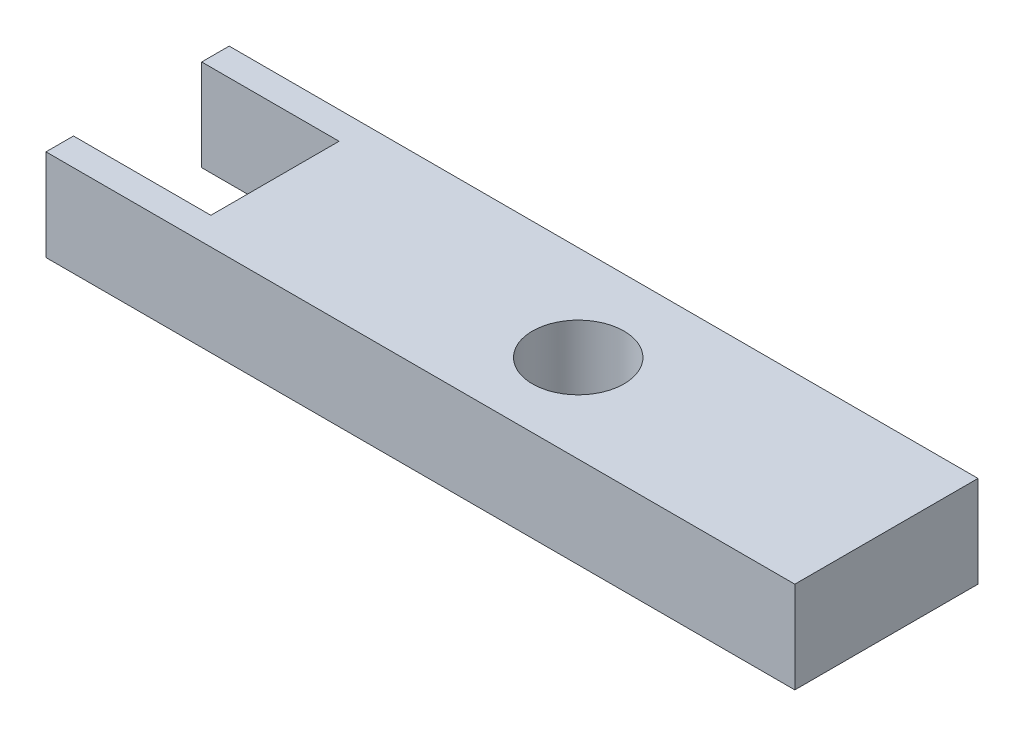
ISO-10303-21;
HEADER;
FILE_DESCRIPTION(('STEP AP214'),'2;1');
FILE_NAME('part.step','',(''),(''),'','','');
FILE_SCHEMA(('AUTOMOTIVE_DESIGN { 1 0 10303 214 1 1 1 1 }'));
ENDSEC;
DATA;
#1=APPLICATION_CONTEXT('core data for automotive mechanical design processes');
#2=APPLICATION_PROTOCOL_DEFINITION('international standard','automotive_design',2000,#1);
#3=PRODUCT_CONTEXT('',#1,'mechanical');
#4=PRODUCT('Part','Part','',(#3));
#5=PRODUCT_RELATED_PRODUCT_CATEGORY('part','',(#4));
#6=PRODUCT_DEFINITION_FORMATION('','',#4);
#7=PRODUCT_DEFINITION_CONTEXT('part definition',#1,'design');
#8=PRODUCT_DEFINITION('design','',#6,#7);
#9=PRODUCT_DEFINITION_SHAPE('','',#8);
#10=(LENGTH_UNIT() NAMED_UNIT(*) SI_UNIT(.MILLI.,.METRE.));
#11=(NAMED_UNIT(*) PLANE_ANGLE_UNIT() SI_UNIT($,.RADIAN.));
#12=(NAMED_UNIT(*) SI_UNIT($,.STERADIAN.) SOLID_ANGLE_UNIT());
#13=UNCERTAINTY_MEASURE_WITH_UNIT(LENGTH_MEASURE(1.E-05),#10,'distance_accuracy_value','');
#14=(GEOMETRIC_REPRESENTATION_CONTEXT(3) GLOBAL_UNCERTAINTY_ASSIGNED_CONTEXT((#13)) GLOBAL_UNIT_ASSIGNED_CONTEXT((#10,
#11,#12)) REPRESENTATION_CONTEXT('',''));
#15=CARTESIAN_POINT('',(0.,0.,0.));
#16=DIRECTION('',(0.,0.,1.));
#17=DIRECTION('',(1.,0.,0.));
#18=AXIS2_PLACEMENT_3D('',#15,#16,#17);
#19=CARTESIAN_POINT('',(0.,5.08,0.));
#20=DIRECTION('',(0.,-1.,0.));
#21=DIRECTION('',(0.,0.,-1.));
#22=AXIS2_PLACEMENT_3D('',#19,#20,#21);
#23=PLANE('',#22);
#24=CARTESIAN_POINT('',(41.5227238293677,5.08,5.27842891038978));
#25=DIRECTION('',(0.,-1.,0.));
#26=DIRECTION('',(0.,0.,-1.));
#27=AXIS2_PLACEMENT_3D('',#24,#25,#26);
#28=CIRCLE('',#27,2.54);
#29=CARTESIAN_POINT('',(41.5227238293677,5.08,2.73842891038978));
#30=VERTEX_POINT('',#29);
#31=EDGE_CURVE('E161',#30,#30,#28,.F.);
#32=ORIENTED_EDGE('',*,*,#31,.F.);
#33=EDGE_LOOP('',(#32));
#34=FACE_BOUND('',#33,.T.);
#35=DIRECTION('',(0.,0.,-1.));
#36=VECTOR('',#35,1.);
#37=CARTESIAN_POINT('',(16.8847238293677,5.08,0.));
#38=LINE('',#37,#36);
#39=CARTESIAN_POINT('',(16.8847238293677,5.08,10.16));
#40=VERTEX_POINT('',#39);
#41=CARTESIAN_POINT('',(16.8847238293677,5.08,8.63600000000001));
#42=VERTEX_POINT('',#41);
#43=EDGE_CURVE('E48',#40,#42,#38,.T.);
#44=ORIENTED_EDGE('',*,*,#43,.F.);
#45=DIRECTION('',(1.,0.,0.));
#46=VECTOR('',#45,1.);
#47=CARTESIAN_POINT('',(58.42,5.08,10.16));
#48=LINE('',#47,#46);
#49=CARTESIAN_POINT('',(58.42,5.08,10.16));
#50=VERTEX_POINT('',#49);
#51=EDGE_CURVE('E110',#40,#50,#48,.T.);
#52=ORIENTED_EDGE('',*,*,#51,.T.);
#53=DIRECTION('',(0.,0.,-1.));
#54=VECTOR('',#53,1.);
#55=CARTESIAN_POINT('',(58.42,5.08,0.));
#56=LINE('',#55,#54);
#57=CARTESIAN_POINT('',(58.42,5.08,0.));
#58=VERTEX_POINT('',#57);
#59=EDGE_CURVE('E135',#50,#58,#56,.T.);
#60=ORIENTED_EDGE('',*,*,#59,.T.);
#61=DIRECTION('',(-1.,0.,0.));
#62=VECTOR('',#61,1.);
#63=CARTESIAN_POINT('',(0.,5.08,0.));
#64=LINE('',#63,#62);
#65=CARTESIAN_POINT('',(16.8847238293677,5.08,0.));
#66=VERTEX_POINT('',#65);
#67=EDGE_CURVE('E124',#58,#66,#64,.T.);
#68=ORIENTED_EDGE('',*,*,#67,.T.);
#69=CARTESIAN_POINT('',(16.8847238293677,5.08,1.52400000000002));
#70=VERTEX_POINT('',#69);
#71=EDGE_CURVE('E103',#70,#66,#38,.T.);
#72=ORIENTED_EDGE('',*,*,#71,.F.);
#73=DIRECTION('',(-1.,0.,0.));
#74=VECTOR('',#73,1.);
#75=CARTESIAN_POINT('',(0.,5.08,1.52400000000002));
#76=LINE('',#75,#74);
#77=CARTESIAN_POINT('',(24.5047238293677,5.08,1.52400000000002));
#78=VERTEX_POINT('',#77);
#79=EDGE_CURVE('E142',#78,#70,#76,.T.);
#80=ORIENTED_EDGE('',*,*,#79,.F.);
#81=DIRECTION('',(0.,0.,-1.));
#82=VECTOR('',#81,1.);
#83=CARTESIAN_POINT('',(24.5047238293677,5.08,0.));
#84=LINE('',#83,#82);
#85=CARTESIAN_POINT('',(24.5047238293677,5.08,8.636));
#86=VERTEX_POINT('',#85);
#87=EDGE_CURVE('E121',#86,#78,#84,.T.);
#88=ORIENTED_EDGE('',*,*,#87,.F.);
#89=DIRECTION('',(1.,0.,0.));
#90=VECTOR('',#89,1.);
#91=CARTESIAN_POINT('',(0.,5.08,8.63600000000002));
#92=LINE('',#91,#90);
#93=EDGE_CURVE('E117',#42,#86,#92,.T.);
#94=ORIENTED_EDGE('',*,*,#93,.F.);
#95=EDGE_LOOP('',(#44,#52,#60,#68,#72,#80,#88,#94));
#96=FACE_BOUND('',#95,.T.);
#97=ADVANCED_FACE('F33',(#34,#96),#23,.F.);
#98=CARTESIAN_POINT('',(0.,0.,0.));
#99=DIRECTION('',(0.,-1.,0.));
#100=DIRECTION('',(0.,0.,-1.));
#101=AXIS2_PLACEMENT_3D('',#98,#99,#100);
#102=PLANE('',#101);
#103=CARTESIAN_POINT('',(41.5227238293677,0.,5.27842891038978));
#104=DIRECTION('',(0.,1.,0.));
#105=DIRECTION('',(0.,0.,1.));
#106=AXIS2_PLACEMENT_3D('',#103,#104,#105);
#107=CIRCLE('',#106,2.54);
#108=CARTESIAN_POINT('',(41.5227238293677,0.,7.81842891038978));
#109=VERTEX_POINT('',#108);
#110=EDGE_CURVE('E164',#109,#109,#107,.T.);
#111=ORIENTED_EDGE('',*,*,#110,.T.);
#112=EDGE_LOOP('',(#111));
#113=FACE_BOUND('',#112,.T.);
#114=DIRECTION('',(1.,0.,0.));
#115=VECTOR('',#114,1.);
#116=CARTESIAN_POINT('',(58.42,0.,10.16));
#117=LINE('',#116,#115);
#118=CARTESIAN_POINT('',(16.8847238293677,0.,10.16));
#119=VERTEX_POINT('',#118);
#120=CARTESIAN_POINT('',(58.42,0.,10.16));
#121=VERTEX_POINT('',#120);
#122=EDGE_CURVE('E108',#119,#121,#117,.T.);
#123=ORIENTED_EDGE('',*,*,#122,.F.);
#124=DIRECTION('',(0.,0.,-1.));
#125=VECTOR('',#124,1.);
#126=CARTESIAN_POINT('',(16.8847238293677,0.,-5.84345348747091));
#127=LINE('',#126,#125);
#128=CARTESIAN_POINT('',(16.8847238293677,0.,8.63600000000001));
#129=VERTEX_POINT('',#128);
#130=EDGE_CURVE('E95',#119,#129,#127,.T.);
#131=ORIENTED_EDGE('',*,*,#130,.T.);
#132=DIRECTION('',(1.,0.,0.));
#133=VECTOR('',#132,1.);
#134=CARTESIAN_POINT('',(0.,0.,8.63600000000002));
#135=LINE('',#134,#133);
#136=CARTESIAN_POINT('',(24.5047238293677,0.,8.636));
#137=VERTEX_POINT('',#136);
#138=EDGE_CURVE('E111',#129,#137,#135,.T.);
#139=ORIENTED_EDGE('',*,*,#138,.T.);
#140=DIRECTION('',(0.,0.,-1.));
#141=VECTOR('',#140,1.);
#142=CARTESIAN_POINT('',(24.5047238293677,0.,1.52400000000002));
#143=LINE('',#142,#141);
#144=CARTESIAN_POINT('',(24.5047238293677,0.,1.52400000000002));
#145=VERTEX_POINT('',#144);
#146=EDGE_CURVE('E153',#137,#145,#143,.T.);
#147=ORIENTED_EDGE('',*,*,#146,.T.);
#148=DIRECTION('',(-1.,0.,0.));
#149=VECTOR('',#148,1.);
#150=CARTESIAN_POINT('',(0.,0.,1.52400000000002));
#151=LINE('',#150,#149);
#152=CARTESIAN_POINT('',(16.8847238293677,0.,1.52400000000002));
#153=VERTEX_POINT('',#152);
#154=EDGE_CURVE('E150',#145,#153,#151,.T.);
#155=ORIENTED_EDGE('',*,*,#154,.T.);
#156=CARTESIAN_POINT('',(16.8847238293677,0.,0.));
#157=VERTEX_POINT('',#156);
#158=EDGE_CURVE('E56',#153,#157,#127,.T.);
#159=ORIENTED_EDGE('',*,*,#158,.T.);
#160=DIRECTION('',(-1.,0.,0.));
#161=VECTOR('',#160,1.);
#162=CARTESIAN_POINT('',(0.,0.,0.));
#163=LINE('',#162,#161);
#164=CARTESIAN_POINT('',(58.42,0.,0.));
#165=VERTEX_POINT('',#164);
#166=EDGE_CURVE('E119',#165,#157,#163,.T.);
#167=ORIENTED_EDGE('',*,*,#166,.F.);
#168=DIRECTION('',(0.,0.,-1.));
#169=VECTOR('',#168,1.);
#170=CARTESIAN_POINT('',(58.42,0.,0.));
#171=LINE('',#170,#169);
#172=EDGE_CURVE('E116',#121,#165,#171,.T.);
#173=ORIENTED_EDGE('',*,*,#172,.F.);
#174=EDGE_LOOP('',(#123,#131,#139,#147,#155,#159,#167,#173));
#175=FACE_BOUND('',#174,.T.);
#176=ADVANCED_FACE('F114',(#113,#175),#102,.T.);
#177=CARTESIAN_POINT('',(58.42,5.08,10.16));
#178=DIRECTION('',(0.,0.,-1.));
#179=DIRECTION('',(-1.,0.,0.));
#180=AXIS2_PLACEMENT_3D('',#177,#178,#179);
#181=PLANE('',#180);
#182=DIRECTION('',(0.,1.,0.));
#183=VECTOR('',#182,1.);
#184=CARTESIAN_POINT('',(16.8847238293677,5.08,10.16));
#185=LINE('',#184,#183);
#186=EDGE_CURVE('E98',#119,#40,#185,.T.);
#187=ORIENTED_EDGE('',*,*,#186,.F.);
#188=ORIENTED_EDGE('',*,*,#122,.T.);
#189=DIRECTION('',(0.,-1.,0.));
#190=VECTOR('',#189,1.);
#191=CARTESIAN_POINT('',(58.42,5.08,10.16));
#192=LINE('',#191,#190);
#193=EDGE_CURVE('E41',#50,#121,#192,.T.);
#194=ORIENTED_EDGE('',*,*,#193,.F.);
#195=ORIENTED_EDGE('',*,*,#51,.F.);
#196=EDGE_LOOP('',(#187,#188,#194,#195));
#197=FACE_BOUND('',#196,.T.);
#198=ADVANCED_FACE('F35',(#197),#181,.F.);
#199=CARTESIAN_POINT('',(0.,5.08,0.));
#200=DIRECTION('',(0.,0.,1.));
#201=DIRECTION('',(1.,0.,0.));
#202=AXIS2_PLACEMENT_3D('',#199,#200,#201);
#203=PLANE('',#202);
#204=DIRECTION('',(0.,-1.,0.));
#205=VECTOR('',#204,1.);
#206=CARTESIAN_POINT('',(16.8847238293677,5.08,0.));
#207=LINE('',#206,#205);
#208=EDGE_CURVE('E158',#66,#157,#207,.T.);
#209=ORIENTED_EDGE('',*,*,#208,.F.);
#210=ORIENTED_EDGE('',*,*,#67,.F.);
#211=DIRECTION('',(0.,-1.,0.));
#212=VECTOR('',#211,1.);
#213=CARTESIAN_POINT('',(58.42,5.08,0.));
#214=LINE('',#213,#212);
#215=EDGE_CURVE('E129',#58,#165,#214,.T.);
#216=ORIENTED_EDGE('',*,*,#215,.T.);
#217=ORIENTED_EDGE('',*,*,#166,.T.);
#218=EDGE_LOOP('',(#209,#210,#216,#217));
#219=FACE_BOUND('',#218,.T.);
#220=ADVANCED_FACE('F194',(#219),#203,.F.);
#221=CARTESIAN_POINT('',(0.,11.938,8.63600000000002));
#222=DIRECTION('',(0.,0.,-1.));
#223=DIRECTION('',(-1.,0.,0.));
#224=AXIS2_PLACEMENT_3D('',#221,#222,#223);
#225=PLANE('',#224);
#226=ORIENTED_EDGE('',*,*,#138,.F.);
#227=DIRECTION('',(0.,1.,0.));
#228=VECTOR('',#227,1.);
#229=CARTESIAN_POINT('',(16.8847238293677,11.938,8.63600000000001));
#230=LINE('',#229,#228);
#231=EDGE_CURVE('E99',#129,#42,#230,.T.);
#232=ORIENTED_EDGE('',*,*,#231,.T.);
#233=ORIENTED_EDGE('',*,*,#93,.T.);
#234=DIRECTION('',(0.,-1.,0.));
#235=VECTOR('',#234,1.);
#236=CARTESIAN_POINT('',(24.5047238293677,11.938,8.636));
#237=LINE('',#236,#235);
#238=EDGE_CURVE('E145',#86,#137,#237,.T.);
#239=ORIENTED_EDGE('',*,*,#238,.T.);
#240=EDGE_LOOP('',(#226,#232,#233,#239));
#241=FACE_BOUND('',#240,.T.);
#242=ADVANCED_FACE('F182',(#241),#225,.T.);
#243=CARTESIAN_POINT('',(0.,11.938,1.52400000000002));
#244=DIRECTION('',(0.,0.,1.));
#245=DIRECTION('',(1.,0.,0.));
#246=AXIS2_PLACEMENT_3D('',#243,#244,#245);
#247=PLANE('',#246);
#248=ORIENTED_EDGE('',*,*,#79,.T.);
#249=DIRECTION('',(0.,-1.,0.));
#250=VECTOR('',#249,1.);
#251=CARTESIAN_POINT('',(16.8847238293677,11.938,1.52400000000002));
#252=LINE('',#251,#250);
#253=EDGE_CURVE('E11',#70,#153,#252,.T.);
#254=ORIENTED_EDGE('',*,*,#253,.T.);
#255=ORIENTED_EDGE('',*,*,#154,.F.);
#256=DIRECTION('',(0.,-1.,0.));
#257=VECTOR('',#256,1.);
#258=CARTESIAN_POINT('',(24.5047238293677,11.938,1.52400000000002));
#259=LINE('',#258,#257);
#260=EDGE_CURVE('E148',#78,#145,#259,.T.);
#261=ORIENTED_EDGE('',*,*,#260,.F.);
#262=EDGE_LOOP('',(#248,#254,#255,#261));
#263=FACE_BOUND('',#262,.T.);
#264=ADVANCED_FACE('F189',(#263),#247,.T.);
#265=CARTESIAN_POINT('',(58.42,5.08,0.));
#266=DIRECTION('',(-1.,0.,0.));
#267=DIRECTION('',(0.,0.,1.));
#268=AXIS2_PLACEMENT_3D('',#265,#266,#267);
#269=PLANE('',#268);
#270=ORIENTED_EDGE('',*,*,#172,.T.);
#271=ORIENTED_EDGE('',*,*,#215,.F.);
#272=ORIENTED_EDGE('',*,*,#59,.F.);
#273=ORIENTED_EDGE('',*,*,#193,.T.);
#274=EDGE_LOOP('',(#270,#271,#272,#273));
#275=FACE_BOUND('',#274,.T.);
#276=ADVANCED_FACE('F133',(#275),#269,.F.);
#277=CARTESIAN_POINT('',(24.5047238293677,11.938,1.52400000000002));
#278=DIRECTION('',(-1.,0.,0.));
#279=DIRECTION('',(0.,0.,1.));
#280=AXIS2_PLACEMENT_3D('',#277,#278,#279);
#281=PLANE('',#280);
#282=ORIENTED_EDGE('',*,*,#87,.T.);
#283=ORIENTED_EDGE('',*,*,#260,.T.);
#284=ORIENTED_EDGE('',*,*,#146,.F.);
#285=ORIENTED_EDGE('',*,*,#238,.F.);
#286=EDGE_LOOP('',(#282,#283,#284,#285));
#287=FACE_BOUND('',#286,.T.);
#288=ADVANCED_FACE('F185',(#287),#281,.T.);
#289=CARTESIAN_POINT('',(16.8847238293677,11.938,-5.84345348747091));
#290=DIRECTION('',(-1.,0.,0.));
#291=DIRECTION('',(0.,0.,1.));
#292=AXIS2_PLACEMENT_3D('',#289,#290,#291);
#293=PLANE('',#292);
#294=ORIENTED_EDGE('',*,*,#208,.T.);
#295=ORIENTED_EDGE('',*,*,#158,.F.);
#296=ORIENTED_EDGE('',*,*,#253,.F.);
#297=ORIENTED_EDGE('',*,*,#71,.T.);
#298=EDGE_LOOP('',(#294,#295,#296,#297));
#299=FACE_BOUND('',#298,.T.);
#300=ADVANCED_FACE('F191',(#299),#293,.T.);
#301=ORIENTED_EDGE('',*,*,#186,.T.);
#302=ORIENTED_EDGE('',*,*,#43,.T.);
#303=ORIENTED_EDGE('',*,*,#231,.F.);
#304=ORIENTED_EDGE('',*,*,#130,.F.);
#305=EDGE_LOOP('',(#301,#302,#303,#304));
#306=FACE_BOUND('',#305,.T.);
#307=ADVANCED_FACE('F97',(#306),#293,.T.);
#308=CARTESIAN_POINT('',(41.5227238293677,8.382,5.27842891038978));
#309=DIRECTION('',(0.,-1.,0.));
#310=DIRECTION('',(0.,0.,-1.));
#311=AXIS2_PLACEMENT_3D('',#308,#309,#310);
#312=CYLINDRICAL_SURFACE('',#311,2.54);
#313=ORIENTED_EDGE('',*,*,#110,.F.);
#314=EDGE_LOOP('',(#313));
#315=FACE_BOUND('',#314,.T.);
#316=ORIENTED_EDGE('',*,*,#31,.T.);
#317=EDGE_LOOP('',(#316));
#318=FACE_BOUND('',#317,.T.);
#319=ADVANCED_FACE('F169',(#315,#318),#312,.F.);
#320=CLOSED_SHELL('',(#97,#176,#198,#220,#242,#264,#276,#288,#300,#307,#319));
#321=MANIFOLD_SOLID_BREP('B2',#320);
#322=ADVANCED_BREP_SHAPE_REPRESENTATION('',(#18,#321),#14);
#323=SHAPE_DEFINITION_REPRESENTATION(#9,#322);
ENDSEC;
END-ISO-10303-21;
